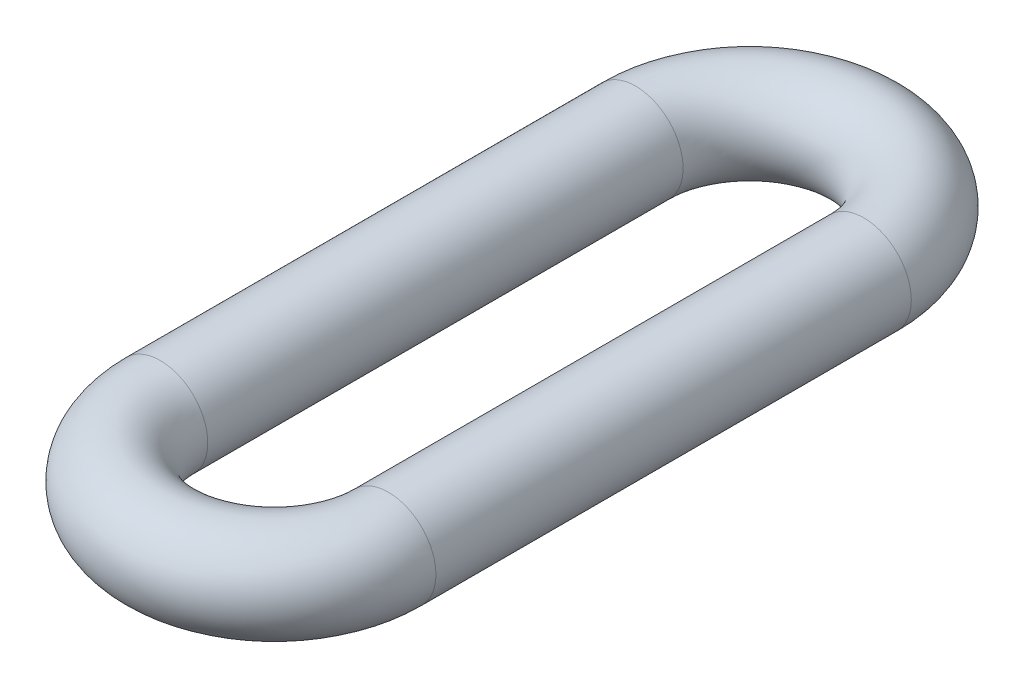
ISO-10303-21;
HEADER;
FILE_DESCRIPTION(('STEP AP214'),'2;1');
FILE_NAME('part.step','',(''),(''),'','','');
FILE_SCHEMA(('AUTOMOTIVE_DESIGN { 1 0 10303 214 1 1 1 1 }'));
ENDSEC;
DATA;
#1=APPLICATION_CONTEXT('core data for automotive mechanical design processes');
#2=APPLICATION_PROTOCOL_DEFINITION('international standard','automotive_design',2000,#1);
#3=PRODUCT_CONTEXT('',#1,'mechanical');
#4=PRODUCT('Part','Part','',(#3));
#5=PRODUCT_RELATED_PRODUCT_CATEGORY('part','',(#4));
#6=PRODUCT_DEFINITION_FORMATION('','',#4);
#7=PRODUCT_DEFINITION_CONTEXT('part definition',#1,'design');
#8=PRODUCT_DEFINITION('design','',#6,#7);
#9=PRODUCT_DEFINITION_SHAPE('','',#8);
#10=(LENGTH_UNIT() NAMED_UNIT(*) SI_UNIT(.MILLI.,.METRE.));
#11=(NAMED_UNIT(*) PLANE_ANGLE_UNIT() SI_UNIT($,.RADIAN.));
#12=(NAMED_UNIT(*) SI_UNIT($,.STERADIAN.) SOLID_ANGLE_UNIT());
#13=UNCERTAINTY_MEASURE_WITH_UNIT(LENGTH_MEASURE(1.E-05),#10,'distance_accuracy_value','');
#14=(GEOMETRIC_REPRESENTATION_CONTEXT(3) GLOBAL_UNCERTAINTY_ASSIGNED_CONTEXT((#13)) GLOBAL_UNIT_ASSIGNED_CONTEXT((#10,
#11,#12)) REPRESENTATION_CONTEXT('',''));
#15=CARTESIAN_POINT('',(0.,0.,0.));
#16=DIRECTION('',(0.,0.,1.));
#17=DIRECTION('',(1.,0.,0.));
#18=AXIS2_PLACEMENT_3D('',#15,#16,#17);
#19=CARTESIAN_POINT('',(0.,0.,-500.));
#20=DIRECTION('',(0.,0.,1.));
#21=DIRECTION('',(1.,0.,0.));
#22=AXIS2_PLACEMENT_3D('',#19,#20,#21);
#23=CYLINDRICAL_SURFACE('',#22,50.);
#24=CARTESIAN_POINT('',(0.,0.,0.));
#25=DIRECTION('',(0.,0.,1.));
#26=DIRECTION('',(1.,0.,0.));
#27=AXIS2_PLACEMENT_3D('',#24,#25,#26);
#28=CIRCLE('',#27,50.);
#29=CARTESIAN_POINT('',(-50.,0.,0.));
#30=VERTEX_POINT('',#29);
#31=EDGE_CURVE('E56',#30,#30,#28,.T.);
#32=ORIENTED_EDGE('',*,*,#31,.F.);
#33=EDGE_LOOP('',(#32));
#34=FACE_BOUND('',#33,.T.);
#35=CARTESIAN_POINT('',(0.,0.,-500.));
#36=DIRECTION('',(0.,0.,1.));
#37=DIRECTION('',(1.,0.,0.));
#38=AXIS2_PLACEMENT_3D('',#35,#36,#37);
#39=CIRCLE('',#38,50.);
#40=CARTESIAN_POINT('',(-49.9999999999999,0.,-500.));
#41=VERTEX_POINT('',#40);
#42=EDGE_CURVE('E41',#41,#41,#39,.T.);
#43=ORIENTED_EDGE('',*,*,#42,.T.);
#44=EDGE_LOOP('',(#43));
#45=FACE_BOUND('',#44,.T.);
#46=ADVANCED_FACE('F38',(#34,#45),#23,.T.);
#47=CARTESIAN_POINT('',(120.,0.,-500.));
#48=DIRECTION('',(0.,1.,0.));
#49=DIRECTION('',(0.,0.,1.));
#50=AXIS2_PLACEMENT_3D('',#47,#48,#49);
#51=TOROIDAL_SURFACE('',#50,120.,50.);
#52=CARTESIAN_POINT('',(240.,0.,-500.));
#53=DIRECTION('',(0.,0.,-1.));
#54=DIRECTION('',(-1.,0.,0.));
#55=AXIS2_PLACEMENT_3D('',#52,#53,#54);
#56=CIRCLE('',#55,50.);
#57=CARTESIAN_POINT('',(290.,0.,-500.));
#58=VERTEX_POINT('',#57);
#59=EDGE_CURVE('E63',#58,#58,#56,.T.);
#60=CARTESIAN_POINT('',(120.,0.,-500.));
#61=DIRECTION('',(0.,1.,0.));
#62=DIRECTION('',(0.,0.,1.));
#63=AXIS2_PLACEMENT_3D('',#60,#61,#62);
#64=CIRCLE('',#63,170.);
#65=EDGE_CURVE('',#58,#41,#64,.T.);
#66=ORIENTED_EDGE('',*,*,#59,.T.);
#67=ORIENTED_EDGE('',*,*,#42,.F.);
#68=ORIENTED_EDGE('',*,*,#65,.T.);
#69=ORIENTED_EDGE('',*,*,#65,.F.);
#70=EDGE_LOOP('',(#66,#68,#67,#69));
#71=FACE_BOUND('',#70,.T.);
#72=ADVANCED_FACE('F111',(#71),#51,.T.);
#73=CARTESIAN_POINT('',(240.,0.,0.));
#74=DIRECTION('',(0.,0.,-1.));
#75=DIRECTION('',(-1.,0.,0.));
#76=AXIS2_PLACEMENT_3D('',#73,#74,#75);
#77=CYLINDRICAL_SURFACE('',#76,50.);
#78=ORIENTED_EDGE('',*,*,#59,.F.);
#79=EDGE_LOOP('',(#78));
#80=FACE_BOUND('',#79,.T.);
#81=CARTESIAN_POINT('',(240.,0.,0.));
#82=DIRECTION('',(0.,0.,-1.));
#83=DIRECTION('',(-1.,0.,0.));
#84=AXIS2_PLACEMENT_3D('',#81,#82,#83);
#85=CIRCLE('',#84,50.);
#86=CARTESIAN_POINT('',(290.,0.,0.));
#87=VERTEX_POINT('',#86);
#88=EDGE_CURVE('E60',#87,#87,#85,.T.);
#89=ORIENTED_EDGE('',*,*,#88,.T.);
#90=EDGE_LOOP('',(#89));
#91=FACE_BOUND('',#90,.T.);
#92=ADVANCED_FACE('F108',(#80,#91),#77,.T.);
#93=CARTESIAN_POINT('',(120.,0.,0.));
#94=DIRECTION('',(0.,1.,0.));
#95=DIRECTION('',(0.,0.,1.));
#96=AXIS2_PLACEMENT_3D('',#93,#94,#95);
#97=TOROIDAL_SURFACE('',#96,120.,50.);
#98=CARTESIAN_POINT('',(120.,0.,0.));
#99=DIRECTION('',(0.,1.,0.));
#100=DIRECTION('',(0.,0.,1.));
#101=AXIS2_PLACEMENT_3D('',#98,#99,#100);
#102=CIRCLE('',#101,170.);
#103=EDGE_CURVE('',#30,#87,#102,.T.);
#104=ORIENTED_EDGE('',*,*,#31,.T.);
#105=ORIENTED_EDGE('',*,*,#88,.F.);
#106=ORIENTED_EDGE('',*,*,#103,.T.);
#107=ORIENTED_EDGE('',*,*,#103,.F.);
#108=EDGE_LOOP('',(#104,#106,#105,#107));
#109=FACE_BOUND('',#108,.T.);
#110=ADVANCED_FACE('F106',(#109),#97,.T.);
#111=CLOSED_SHELL('',(#46,#72,#92,#110));
#112=CARTESIAN_POINT('',(0.,0.,-500.));
#113=DIRECTION('',(0.,0.,1.));
#114=DIRECTION('',(1.,0.,0.));
#115=AXIS2_PLACEMENT_3D('',#112,#113,#114);
#116=CYLINDRICAL_SURFACE('',#115,40.);
#117=CARTESIAN_POINT('',(0.,0.,0.));
#118=DIRECTION('',(0.,0.,1.));
#119=DIRECTION('',(1.,0.,0.));
#120=AXIS2_PLACEMENT_3D('',#117,#118,#119);
#121=CIRCLE('',#120,40.);
#122=CARTESIAN_POINT('',(-40.,0.,0.));
#123=VERTEX_POINT('',#122);
#124=EDGE_CURVE('E70',#123,#123,#121,.F.);
#125=ORIENTED_EDGE('',*,*,#124,.F.);
#126=EDGE_LOOP('',(#125));
#127=FACE_BOUND('',#126,.T.);
#128=CARTESIAN_POINT('',(0.,0.,-500.));
#129=DIRECTION('',(0.,0.,1.));
#130=DIRECTION('',(1.,0.,0.));
#131=AXIS2_PLACEMENT_3D('',#128,#129,#130);
#132=CIRCLE('',#131,40.);
#133=CARTESIAN_POINT('',(-40.,0.,-500.));
#134=VERTEX_POINT('',#133);
#135=EDGE_CURVE('E10',#134,#134,#132,.F.);
#136=ORIENTED_EDGE('',*,*,#135,.T.);
#137=EDGE_LOOP('',(#136));
#138=FACE_BOUND('',#137,.T.);
#139=ADVANCED_FACE('F94',(#127,#138),#116,.F.);
#140=CARTESIAN_POINT('',(120.,0.,-500.));
#141=DIRECTION('',(0.,1.,0.));
#142=DIRECTION('',(0.,0.,1.));
#143=AXIS2_PLACEMENT_3D('',#140,#141,#142);
#144=TOROIDAL_SURFACE('',#143,120.,40.);
#145=CARTESIAN_POINT('',(240.,0.,-500.));
#146=DIRECTION('',(0.,0.,-1.));
#147=DIRECTION('',(-1.,0.,0.));
#148=AXIS2_PLACEMENT_3D('',#145,#146,#147);
#149=CIRCLE('',#148,40.);
#150=CARTESIAN_POINT('',(280.,0.,-500.));
#151=VERTEX_POINT('',#150);
#152=EDGE_CURVE('E46',#151,#151,#149,.F.);
#153=CARTESIAN_POINT('',(120.,0.,-500.));
#154=DIRECTION('',(0.,1.,0.));
#155=DIRECTION('',(0.,0.,1.));
#156=AXIS2_PLACEMENT_3D('',#153,#154,#155);
#157=CIRCLE('',#156,160.);
#158=EDGE_CURVE('',#151,#134,#157,.T.);
#159=ORIENTED_EDGE('',*,*,#152,.T.);
#160=ORIENTED_EDGE('',*,*,#135,.F.);
#161=ORIENTED_EDGE('',*,*,#158,.T.);
#162=ORIENTED_EDGE('',*,*,#158,.F.);
#163=EDGE_LOOP('',(#159,#161,#160,#162));
#164=FACE_BOUND('',#163,.T.);
#165=ADVANCED_FACE('F91',(#164),#144,.F.);
#166=CARTESIAN_POINT('',(240.,0.,0.));
#167=DIRECTION('',(0.,0.,-1.));
#168=DIRECTION('',(-1.,0.,0.));
#169=AXIS2_PLACEMENT_3D('',#166,#167,#168);
#170=CYLINDRICAL_SURFACE('',#169,40.);
#171=ORIENTED_EDGE('',*,*,#152,.F.);
#172=EDGE_LOOP('',(#171));
#173=FACE_BOUND('',#172,.T.);
#174=CARTESIAN_POINT('',(240.,0.,0.));
#175=DIRECTION('',(0.,0.,-1.));
#176=DIRECTION('',(-1.,0.,0.));
#177=AXIS2_PLACEMENT_3D('',#174,#175,#176);
#178=CIRCLE('',#177,40.);
#179=CARTESIAN_POINT('',(280.,0.,0.));
#180=VERTEX_POINT('',#179);
#181=EDGE_CURVE('E52',#180,#180,#178,.F.);
#182=ORIENTED_EDGE('',*,*,#181,.T.);
#183=EDGE_LOOP('',(#182));
#184=FACE_BOUND('',#183,.T.);
#185=ADVANCED_FACE('F82',(#173,#184),#170,.F.);
#186=CARTESIAN_POINT('',(120.,0.,0.));
#187=DIRECTION('',(0.,1.,0.));
#188=DIRECTION('',(0.,0.,1.));
#189=AXIS2_PLACEMENT_3D('',#186,#187,#188);
#190=TOROIDAL_SURFACE('',#189,120.,40.);
#191=CARTESIAN_POINT('',(120.,0.,0.));
#192=DIRECTION('',(0.,1.,0.));
#193=DIRECTION('',(0.,0.,1.));
#194=AXIS2_PLACEMENT_3D('',#191,#192,#193);
#195=CIRCLE('',#194,160.);
#196=EDGE_CURVE('',#123,#180,#195,.T.);
#197=ORIENTED_EDGE('',*,*,#124,.T.);
#198=ORIENTED_EDGE('',*,*,#181,.F.);
#199=ORIENTED_EDGE('',*,*,#196,.T.);
#200=ORIENTED_EDGE('',*,*,#196,.F.);
#201=EDGE_LOOP('',(#197,#199,#198,#200));
#202=FACE_BOUND('',#201,.T.);
#203=ADVANCED_FACE('F84',(#202),#190,.F.);
#204=CLOSED_SHELL('',(#139,#165,#185,#203));
#205=ORIENTED_CLOSED_SHELL('',*,#204,.T.);
#206=BREP_WITH_VOIDS('B2',#111,(#205));
#207=ADVANCED_BREP_SHAPE_REPRESENTATION('',(#18,#206),#14);
#208=SHAPE_DEFINITION_REPRESENTATION(#9,#207);
ENDSEC;
END-ISO-10303-21;
